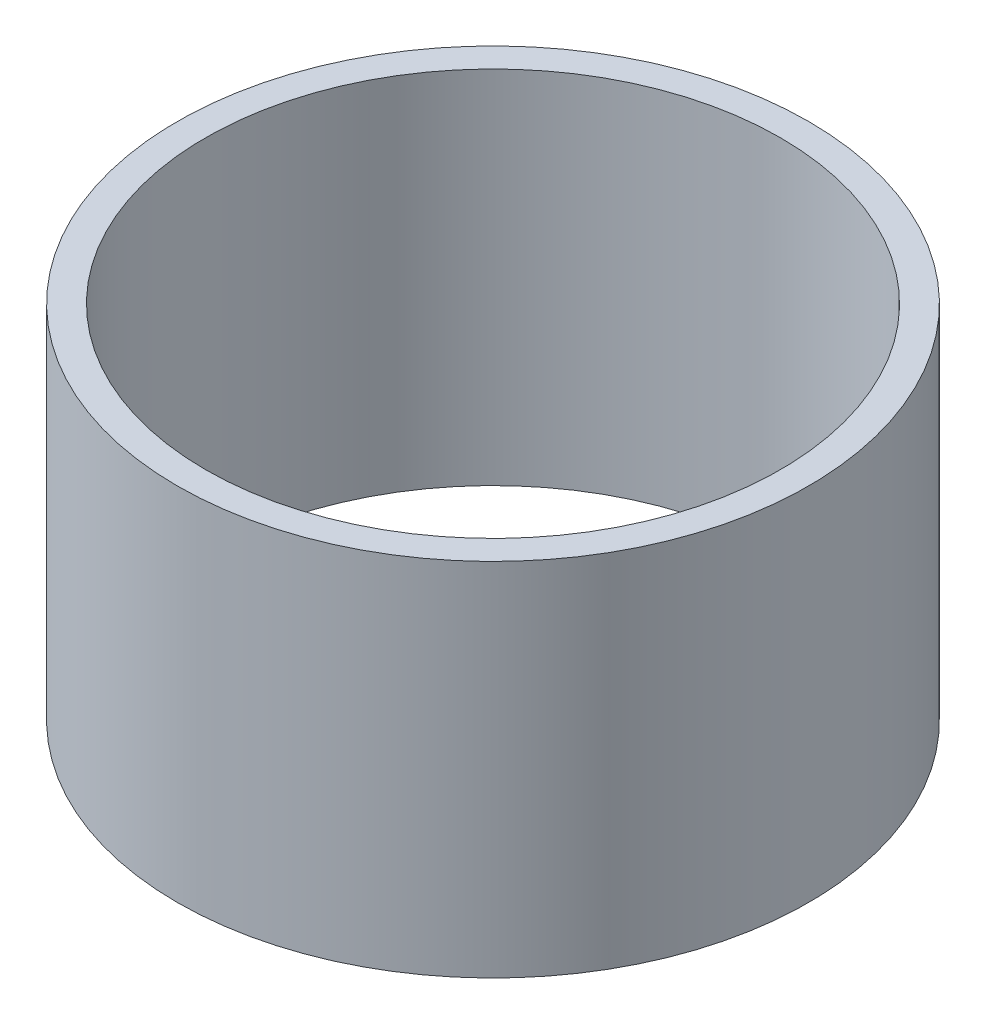
ISO-10303-21;
HEADER;
FILE_DESCRIPTION(('STEP AP214'),'2;1');
FILE_NAME('part.step','',(''),(''),'','','');
FILE_SCHEMA(('AUTOMOTIVE_DESIGN { 1 0 10303 214 1 1 1 1 }'));
ENDSEC;
DATA;
#1=APPLICATION_CONTEXT('core data for automotive mechanical design processes');
#2=APPLICATION_PROTOCOL_DEFINITION('international standard','automotive_design',2000,#1);
#3=PRODUCT_CONTEXT('',#1,'mechanical');
#4=PRODUCT('Part','Part','',(#3));
#5=PRODUCT_RELATED_PRODUCT_CATEGORY('part','',(#4));
#6=PRODUCT_DEFINITION_FORMATION('','',#4);
#7=PRODUCT_DEFINITION_CONTEXT('part definition',#1,'design');
#8=PRODUCT_DEFINITION('design','',#6,#7);
#9=PRODUCT_DEFINITION_SHAPE('','',#8);
#10=(LENGTH_UNIT() NAMED_UNIT(*) SI_UNIT(.MILLI.,.METRE.));
#11=(NAMED_UNIT(*) PLANE_ANGLE_UNIT() SI_UNIT($,.RADIAN.));
#12=(NAMED_UNIT(*) SI_UNIT($,.STERADIAN.) SOLID_ANGLE_UNIT());
#13=UNCERTAINTY_MEASURE_WITH_UNIT(LENGTH_MEASURE(1.E-05),#10,'distance_accuracy_value','');
#14=(GEOMETRIC_REPRESENTATION_CONTEXT(3) GLOBAL_UNCERTAINTY_ASSIGNED_CONTEXT((#13)) GLOBAL_UNIT_ASSIGNED_CONTEXT((#10,
#11,#12)) REPRESENTATION_CONTEXT('',''));
#15=CARTESIAN_POINT('',(0.,0.,0.));
#16=DIRECTION('',(0.,0.,1.));
#17=DIRECTION('',(1.,0.,0.));
#18=AXIS2_PLACEMENT_3D('',#15,#16,#17);
#19=CARTESIAN_POINT('',(-0.2409298282456,101.0421066882,166.2415147255));
#20=DIRECTION('',(0.,1.,0.));
#21=DIRECTION('',(0.,0.,1.));
#22=AXIS2_PLACEMENT_3D('',#19,#20,#21);
#23=CYLINDRICAL_SURFACE('',#22,13.9999999999929);
#24=CARTESIAN_POINT('',(-0.240929828245601,117.042106688199,166.2415147255));
#25=DIRECTION('',(0.,1.,0.));
#26=DIRECTION('',(0.,0.,1.));
#27=AXIS2_PLACEMENT_3D('',#24,#25,#26);
#28=CIRCLE('',#27,13.9999999999929);
#29=CARTESIAN_POINT('',(-0.240929828245601,117.042106688199,180.241514725493));
#30=VERTEX_POINT('',#29);
#31=EDGE_CURVE('E31',#30,#30,#28,.F.);
#32=ORIENTED_EDGE('',*,*,#31,.T.);
#33=EDGE_LOOP('',(#32));
#34=FACE_BOUND('',#33,.T.);
#35=CARTESIAN_POINT('',(-0.2409298282456,101.0421066882,166.2415147255));
#36=DIRECTION('',(0.,1.,0.));
#37=DIRECTION('',(0.,0.,1.));
#38=AXIS2_PLACEMENT_3D('',#35,#36,#37);
#39=CIRCLE('',#38,13.9999999999929);
#40=CARTESIAN_POINT('',(-0.2409298282456,101.0421066882,180.241514725493));
#41=VERTEX_POINT('',#40);
#42=EDGE_CURVE('E18',#41,#41,#39,.F.);
#43=ORIENTED_EDGE('',*,*,#42,.F.);
#44=EDGE_LOOP('',(#43));
#45=FACE_BOUND('',#44,.T.);
#46=ADVANCED_FACE('F14',(#34,#45),#23,.T.);
#47=CARTESIAN_POINT('',(15.85783510443,101.0421066882,179.0909574676));
#48=DIRECTION('',(0.,-1.,0.));
#49=DIRECTION('',(-0.99372098112642,0.,0.111886601830359));
#50=AXIS2_PLACEMENT_3D('',#47,#48,#49);
#51=PLANE('',#50);
#52=CARTESIAN_POINT('',(-0.2409298282456,101.0421066882,166.2415147255));
#53=DIRECTION('',(0.,1.,0.));
#54=DIRECTION('',(0.,0.,1.));
#55=AXIS2_PLACEMENT_3D('',#52,#53,#54);
#56=CIRCLE('',#55,12.7499999999996);
#57=CARTESIAN_POINT('',(-0.2409298282456,101.0421066882,178.9915147255));
#58=VERTEX_POINT('',#57);
#59=EDGE_CURVE('E23',#58,#58,#56,.F.);
#60=ORIENTED_EDGE('',*,*,#59,.F.);
#61=EDGE_LOOP('',(#60));
#62=FACE_BOUND('',#61,.T.);
#63=ORIENTED_EDGE('',*,*,#42,.T.);
#64=EDGE_LOOP('',(#63));
#65=FACE_BOUND('',#64,.T.);
#66=ADVANCED_FACE('F40',(#62,#65),#51,.T.);
#67=CARTESIAN_POINT('',(15.85783510443,117.0421066882,179.0909574676));
#68=DIRECTION('',(0.,-1.,0.));
#69=DIRECTION('',(-0.99372098112642,0.,0.111886601830359));
#70=AXIS2_PLACEMENT_3D('',#67,#68,#69);
#71=PLANE('',#70);
#72=CARTESIAN_POINT('',(-0.240929828245601,117.042106688199,166.2415147255));
#73=DIRECTION('',(0.,1.,0.));
#74=DIRECTION('',(0.,0.,1.));
#75=AXIS2_PLACEMENT_3D('',#72,#73,#74);
#76=CIRCLE('',#75,12.7499999999996);
#77=CARTESIAN_POINT('',(-0.240929828245601,117.042106688199,178.9915147255));
#78=VERTEX_POINT('',#77);
#79=EDGE_CURVE('E10',#78,#78,#76,.T.);
#80=ORIENTED_EDGE('',*,*,#79,.F.);
#81=EDGE_LOOP('',(#80));
#82=FACE_BOUND('',#81,.T.);
#83=ORIENTED_EDGE('',*,*,#31,.F.);
#84=EDGE_LOOP('',(#83));
#85=FACE_BOUND('',#84,.T.);
#86=ADVANCED_FACE('F16',(#82,#85),#71,.F.);
#87=CARTESIAN_POINT('',(-0.2409298282456,101.0421066882,166.2415147255));
#88=DIRECTION('',(0.,1.,0.));
#89=DIRECTION('',(0.,0.,1.));
#90=AXIS2_PLACEMENT_3D('',#87,#88,#89);
#91=CYLINDRICAL_SURFACE('',#90,12.7499999999996);
#92=ORIENTED_EDGE('',*,*,#79,.T.);
#93=EDGE_LOOP('',(#92));
#94=FACE_BOUND('',#93,.T.);
#95=ORIENTED_EDGE('',*,*,#59,.T.);
#96=EDGE_LOOP('',(#95));
#97=FACE_BOUND('',#96,.T.);
#98=ADVANCED_FACE('F50',(#94,#97),#91,.F.);
#99=CLOSED_SHELL('',(#46,#66,#86,#98));
#100=MANIFOLD_SOLID_BREP('B1',#99);
#101=ADVANCED_BREP_SHAPE_REPRESENTATION('',(#18,#100),#14);
#102=SHAPE_DEFINITION_REPRESENTATION(#9,#101);
ENDSEC;
END-ISO-10303-21;
